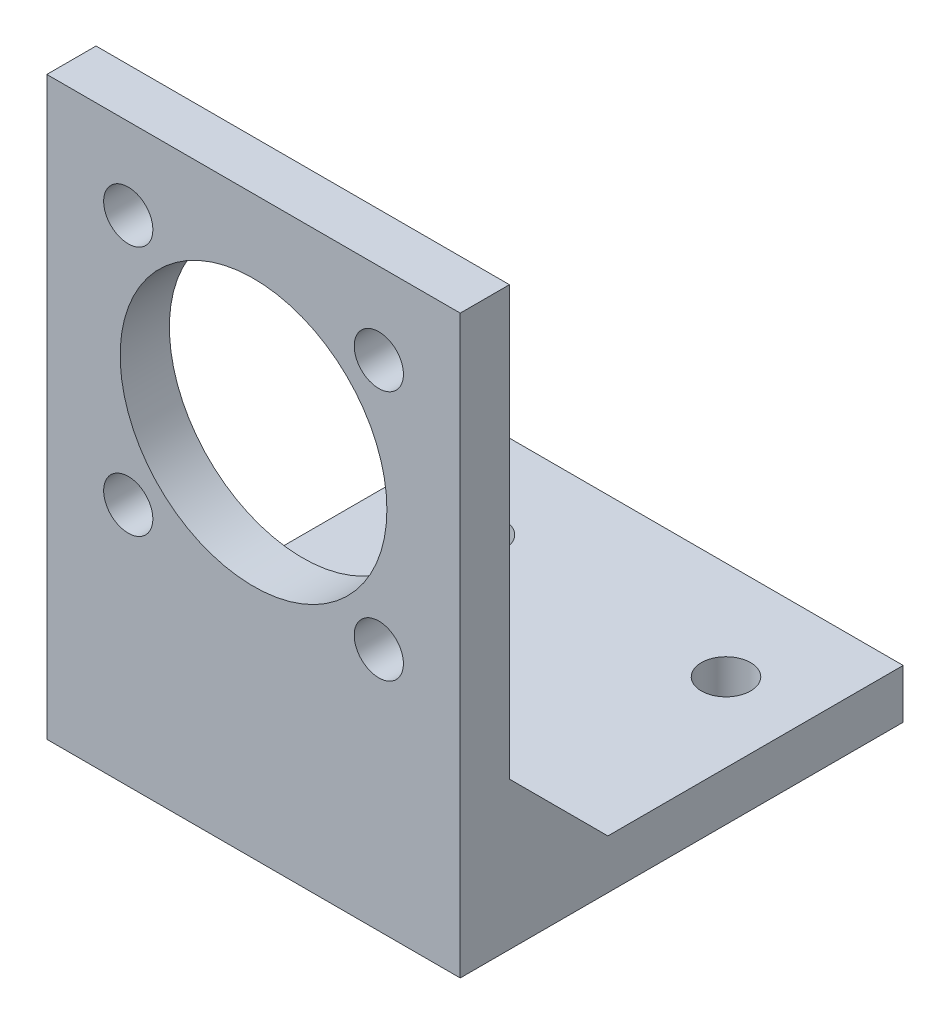
ISO-10303-21;
HEADER;
FILE_DESCRIPTION(('STEP AP214'),'2;1');
FILE_NAME('part.step','',(''),(''),'','','');
FILE_SCHEMA(('AUTOMOTIVE_DESIGN { 1 0 10303 214 1 1 1 1 }'));
ENDSEC;
DATA;
#1=APPLICATION_CONTEXT('core data for automotive mechanical design processes');
#2=APPLICATION_PROTOCOL_DEFINITION('international standard','automotive_design',2000,#1);
#3=PRODUCT_CONTEXT('',#1,'mechanical');
#4=PRODUCT('Part','Part','',(#3));
#5=PRODUCT_RELATED_PRODUCT_CATEGORY('part','',(#4));
#6=PRODUCT_DEFINITION_FORMATION('','',#4);
#7=PRODUCT_DEFINITION_CONTEXT('part definition',#1,'design');
#8=PRODUCT_DEFINITION('design','',#6,#7);
#9=PRODUCT_DEFINITION_SHAPE('','',#8);
#10=(LENGTH_UNIT() NAMED_UNIT(*) SI_UNIT(.MILLI.,.METRE.));
#11=(NAMED_UNIT(*) PLANE_ANGLE_UNIT() SI_UNIT($,.RADIAN.));
#12=(NAMED_UNIT(*) SI_UNIT($,.STERADIAN.) SOLID_ANGLE_UNIT());
#13=UNCERTAINTY_MEASURE_WITH_UNIT(LENGTH_MEASURE(1.E-05),#10,'distance_accuracy_value','');
#14=(GEOMETRIC_REPRESENTATION_CONTEXT(3) GLOBAL_UNCERTAINTY_ASSIGNED_CONTEXT((#13)) GLOBAL_UNIT_ASSIGNED_CONTEXT((#10,
#11,#12)) REPRESENTATION_CONTEXT('',''));
#15=CARTESIAN_POINT('',(0.,0.,0.));
#16=DIRECTION('',(0.,0.,1.));
#17=DIRECTION('',(1.,0.,0.));
#18=AXIS2_PLACEMENT_3D('',#15,#16,#17);
#19=CARTESIAN_POINT('',(0.,5.,0.));
#20=DIRECTION('',(0.,1.,0.));
#21=DIRECTION('',(0.,0.,1.));
#22=AXIS2_PLACEMENT_3D('',#19,#20,#21);
#23=PLANE('',#22);
#24=DIRECTION('',(1.,0.,0.));
#25=VECTOR('',#24,1.);
#26=CARTESIAN_POINT('',(-42.,5.,30.));
#27=LINE('',#26,#25);
#28=CARTESIAN_POINT('',(-42.,5.,30.));
#29=VERTEX_POINT('',#28);
#30=CARTESIAN_POINT('',(-37.,5.,30.));
#31=VERTEX_POINT('',#30);
#32=EDGE_CURVE('E55',#29,#31,#27,.T.);
#33=ORIENTED_EDGE('',*,*,#32,.T.);
#34=DIRECTION('',(0.,0.,-1.));
#35=VECTOR('',#34,1.);
#36=CARTESIAN_POINT('',(-37.,5.,40.));
#37=LINE('',#36,#35);
#38=CARTESIAN_POINT('',(-37.,5.,40.));
#39=VERTEX_POINT('',#38);
#40=EDGE_CURVE('E129',#39,#31,#37,.T.);
#41=ORIENTED_EDGE('',*,*,#40,.F.);
#42=DIRECTION('',(1.,0.,0.));
#43=VECTOR('',#42,1.);
#44=CARTESIAN_POINT('',(0.,5.,40.));
#45=LINE('',#44,#43);
#46=CARTESIAN_POINT('',(-5.,5.,40.));
#47=VERTEX_POINT('',#46);
#48=EDGE_CURVE('E115',#39,#47,#45,.T.);
#49=ORIENTED_EDGE('',*,*,#48,.T.);
#50=DIRECTION('',(0.,0.,-1.));
#51=VECTOR('',#50,1.);
#52=CARTESIAN_POINT('',(-5.,5.,40.));
#53=LINE('',#52,#51);
#54=CARTESIAN_POINT('',(-5.,5.,30.));
#55=VERTEX_POINT('',#54);
#56=EDGE_CURVE('E156',#47,#55,#53,.T.);
#57=ORIENTED_EDGE('',*,*,#56,.T.);
#58=DIRECTION('',(1.,0.,0.));
#59=VECTOR('',#58,1.);
#60=CARTESIAN_POINT('',(-5.,5.,30.));
#61=LINE('',#60,#59);
#62=CARTESIAN_POINT('',(0.,5.,30.));
#63=VERTEX_POINT('',#62);
#64=EDGE_CURVE('E162',#55,#63,#61,.T.);
#65=ORIENTED_EDGE('',*,*,#64,.T.);
#66=DIRECTION('',(0.,0.,-1.));
#67=VECTOR('',#66,1.);
#68=CARTESIAN_POINT('',(0.,5.,0.));
#69=LINE('',#68,#67);
#70=CARTESIAN_POINT('',(0.,5.,0.));
#71=VERTEX_POINT('',#70);
#72=EDGE_CURVE('E126',#63,#71,#69,.T.);
#73=ORIENTED_EDGE('',*,*,#72,.T.);
#74=DIRECTION('',(-1.,0.,0.));
#75=VECTOR('',#74,1.);
#76=CARTESIAN_POINT('',(0.,5.,0.));
#77=LINE('',#76,#75);
#78=CARTESIAN_POINT('',(-42.,5.,0.));
#79=VERTEX_POINT('',#78);
#80=EDGE_CURVE('E258',#71,#79,#77,.T.);
#81=ORIENTED_EDGE('',*,*,#80,.T.);
#82=DIRECTION('',(0.,0.,1.));
#83=VECTOR('',#82,1.);
#84=CARTESIAN_POINT('',(-42.,5.,0.));
#85=LINE('',#84,#83);
#86=EDGE_CURVE('E60',#79,#29,#85,.T.);
#87=ORIENTED_EDGE('',*,*,#86,.T.);
#88=EDGE_LOOP('',(#33,#41,#49,#57,#65,#73,#81,#87));
#89=FACE_BOUND('',#88,.T.);
#90=CARTESIAN_POINT('',(-33.,5.,10.));
#91=DIRECTION('',(0.,1.,0.));
#92=DIRECTION('',(0.,0.,1.));
#93=AXIS2_PLACEMENT_3D('',#90,#91,#92);
#94=CIRCLE('',#93,2.5);
#95=CARTESIAN_POINT('',(-33.,5.,12.5));
#96=VERTEX_POINT('',#95);
#97=EDGE_CURVE('E250',#96,#96,#94,.T.);
#98=ORIENTED_EDGE('',*,*,#97,.F.);
#99=EDGE_LOOP('',(#98));
#100=FACE_BOUND('',#99,.T.);
#101=CARTESIAN_POINT('',(-8.,5.,10.));
#102=DIRECTION('',(0.,1.,0.));
#103=DIRECTION('',(0.,0.,1.));
#104=AXIS2_PLACEMENT_3D('',#101,#102,#103);
#105=CIRCLE('',#104,2.5);
#106=CARTESIAN_POINT('',(-8.,5.,12.5));
#107=VERTEX_POINT('',#106);
#108=EDGE_CURVE('E242',#107,#107,#105,.T.);
#109=ORIENTED_EDGE('',*,*,#108,.F.);
#110=EDGE_LOOP('',(#109));
#111=FACE_BOUND('',#110,.T.);
#112=ADVANCED_FACE('F39',(#89,#100,#111),#23,.T.);
#113=CARTESIAN_POINT('',(0.,0.,0.));
#114=DIRECTION('',(0.,1.,0.));
#115=DIRECTION('',(0.,0.,1.));
#116=AXIS2_PLACEMENT_3D('',#113,#114,#115);
#117=PLANE('',#116);
#118=DIRECTION('',(-1.,0.,0.));
#119=VECTOR('',#118,1.);
#120=CARTESIAN_POINT('',(0.,0.,0.));
#121=LINE('',#120,#119);
#122=CARTESIAN_POINT('',(0.,0.,0.));
#123=VERTEX_POINT('',#122);
#124=CARTESIAN_POINT('',(-42.,0.,0.));
#125=VERTEX_POINT('',#124);
#126=EDGE_CURVE('E254',#123,#125,#121,.T.);
#127=ORIENTED_EDGE('',*,*,#126,.F.);
#128=DIRECTION('',(0.,0.,-1.));
#129=VECTOR('',#128,1.);
#130=CARTESIAN_POINT('',(0.,0.,0.));
#131=LINE('',#130,#129);
#132=CARTESIAN_POINT('',(0.,0.,45.));
#133=VERTEX_POINT('',#132);
#134=EDGE_CURVE('E261',#133,#123,#131,.T.);
#135=ORIENTED_EDGE('',*,*,#134,.F.);
#136=DIRECTION('',(1.,0.,0.));
#137=VECTOR('',#136,1.);
#138=CARTESIAN_POINT('',(-42.,0.,45.));
#139=LINE('',#138,#137);
#140=CARTESIAN_POINT('',(-42.,0.,45.));
#141=VERTEX_POINT('',#140);
#142=EDGE_CURVE('E214',#141,#133,#139,.T.);
#143=ORIENTED_EDGE('',*,*,#142,.F.);
#144=DIRECTION('',(0.,0.,1.));
#145=VECTOR('',#144,1.);
#146=CARTESIAN_POINT('',(-42.,0.,0.));
#147=LINE('',#146,#145);
#148=EDGE_CURVE('E269',#125,#141,#147,.T.);
#149=ORIENTED_EDGE('',*,*,#148,.F.);
#150=EDGE_LOOP('',(#127,#135,#143,#149));
#151=FACE_BOUND('',#150,.T.);
#152=CARTESIAN_POINT('',(-33.,0.,10.));
#153=DIRECTION('',(0.,1.,0.));
#154=DIRECTION('',(0.,0.,1.));
#155=AXIS2_PLACEMENT_3D('',#152,#153,#154);
#156=CIRCLE('',#155,2.5);
#157=CARTESIAN_POINT('',(-33.,0.,12.5));
#158=VERTEX_POINT('',#157);
#159=EDGE_CURVE('E246',#158,#158,#156,.T.);
#160=ORIENTED_EDGE('',*,*,#159,.T.);
#161=EDGE_LOOP('',(#160));
#162=FACE_BOUND('',#161,.T.);
#163=CARTESIAN_POINT('',(-8.,0.,10.));
#164=DIRECTION('',(0.,1.,0.));
#165=DIRECTION('',(0.,0.,1.));
#166=AXIS2_PLACEMENT_3D('',#163,#164,#165);
#167=CIRCLE('',#166,2.5);
#168=CARTESIAN_POINT('',(-8.,0.,12.5));
#169=VERTEX_POINT('',#168);
#170=EDGE_CURVE('E241',#169,#169,#167,.T.);
#171=ORIENTED_EDGE('',*,*,#170,.T.);
#172=EDGE_LOOP('',(#171));
#173=FACE_BOUND('',#172,.T.);
#174=ADVANCED_FACE('F283',(#151,#162,#173),#117,.F.);
#175=CARTESIAN_POINT('',(0.,5.,0.));
#176=DIRECTION('',(0.,0.,1.));
#177=DIRECTION('',(1.,0.,0.));
#178=AXIS2_PLACEMENT_3D('',#175,#176,#177);
#179=PLANE('',#178);
#180=ORIENTED_EDGE('',*,*,#126,.T.);
#181=DIRECTION('',(0.,-1.,0.));
#182=VECTOR('',#181,1.);
#183=CARTESIAN_POINT('',(-42.,5.,0.));
#184=LINE('',#183,#182);
#185=EDGE_CURVE('E11',#79,#125,#184,.T.);
#186=ORIENTED_EDGE('',*,*,#185,.F.);
#187=ORIENTED_EDGE('',*,*,#80,.F.);
#188=DIRECTION('',(0.,-1.,0.));
#189=VECTOR('',#188,1.);
#190=CARTESIAN_POINT('',(0.,5.,0.));
#191=LINE('',#190,#189);
#192=EDGE_CURVE('E48',#71,#123,#191,.T.);
#193=ORIENTED_EDGE('',*,*,#192,.T.);
#194=EDGE_LOOP('',(#180,#186,#187,#193));
#195=FACE_BOUND('',#194,.T.);
#196=ADVANCED_FACE('F41',(#195),#179,.F.);
#197=CARTESIAN_POINT('',(-42.,5.,0.));
#198=DIRECTION('',(1.,0.,0.));
#199=DIRECTION('',(0.,0.,-1.));
#200=AXIS2_PLACEMENT_3D('',#197,#198,#199);
#201=PLANE('',#200);
#202=DIRECTION('',(0.,0.707106781186547,0.707106781186548));
#203=VECTOR('',#202,1.);
#204=CARTESIAN_POINT('',(-42.,5.,30.));
#205=LINE('',#204,#203);
#206=CARTESIAN_POINT('',(-42.,15.,40.));
#207=VERTEX_POINT('',#206);
#208=EDGE_CURVE('E134',#29,#207,#205,.T.);
#209=ORIENTED_EDGE('',*,*,#208,.F.);
#210=ORIENTED_EDGE('',*,*,#86,.F.);
#211=ORIENTED_EDGE('',*,*,#185,.T.);
#212=ORIENTED_EDGE('',*,*,#148,.T.);
#213=DIRECTION('',(0.,-1.,0.));
#214=VECTOR('',#213,1.);
#215=CARTESIAN_POINT('',(-42.,0.,45.));
#216=LINE('',#215,#214);
#217=CARTESIAN_POINT('',(-42.,58.5,45.));
#218=VERTEX_POINT('',#217);
#219=EDGE_CURVE('E210',#218,#141,#216,.T.);
#220=ORIENTED_EDGE('',*,*,#219,.F.);
#221=DIRECTION('',(0.,0.,-1.));
#222=VECTOR('',#221,1.);
#223=CARTESIAN_POINT('',(-42.,58.5,45.));
#224=LINE('',#223,#222);
#225=CARTESIAN_POINT('',(-42.,58.5,40.));
#226=VERTEX_POINT('',#225);
#227=EDGE_CURVE('E225',#218,#226,#224,.T.);
#228=ORIENTED_EDGE('',*,*,#227,.T.);
#229=DIRECTION('',(0.,-1.,0.));
#230=VECTOR('',#229,1.);
#231=CARTESIAN_POINT('',(-42.,0.,40.));
#232=LINE('',#231,#230);
#233=EDGE_CURVE('E206',#226,#207,#232,.T.);
#234=ORIENTED_EDGE('',*,*,#233,.T.);
#235=EDGE_LOOP('',(#209,#210,#211,#212,#220,#228,#234));
#236=FACE_BOUND('',#235,.T.);
#237=ADVANCED_FACE('F289',(#236),#201,.F.);
#238=CARTESIAN_POINT('',(0.,5.,0.));
#239=DIRECTION('',(-1.,0.,0.));
#240=DIRECTION('',(0.,0.,1.));
#241=AXIS2_PLACEMENT_3D('',#238,#239,#240);
#242=PLANE('',#241);
#243=ORIENTED_EDGE('',*,*,#72,.F.);
#244=DIRECTION('',(0.,0.707106781186547,0.707106781186548));
#245=VECTOR('',#244,1.);
#246=CARTESIAN_POINT('',(0.,5.,30.));
#247=LINE('',#246,#245);
#248=CARTESIAN_POINT('',(0.,15.,40.));
#249=VERTEX_POINT('',#248);
#250=EDGE_CURVE('E146',#63,#249,#247,.T.);
#251=ORIENTED_EDGE('',*,*,#250,.T.);
#252=DIRECTION('',(0.,1.,0.));
#253=VECTOR('',#252,1.);
#254=CARTESIAN_POINT('',(0.,0.,40.));
#255=LINE('',#254,#253);
#256=CARTESIAN_POINT('',(0.,58.5,40.));
#257=VERTEX_POINT('',#256);
#258=EDGE_CURVE('E229',#249,#257,#255,.T.);
#259=ORIENTED_EDGE('',*,*,#258,.T.);
#260=DIRECTION('',(0.,0.,-1.));
#261=VECTOR('',#260,1.);
#262=CARTESIAN_POINT('',(0.,58.5,45.));
#263=LINE('',#262,#261);
#264=CARTESIAN_POINT('',(0.,58.5,45.));
#265=VERTEX_POINT('',#264);
#266=EDGE_CURVE('E237',#265,#257,#263,.T.);
#267=ORIENTED_EDGE('',*,*,#266,.F.);
#268=DIRECTION('',(0.,1.,0.));
#269=VECTOR('',#268,1.);
#270=CARTESIAN_POINT('',(0.,0.,45.));
#271=LINE('',#270,#269);
#272=EDGE_CURVE('E219',#133,#265,#271,.T.);
#273=ORIENTED_EDGE('',*,*,#272,.F.);
#274=ORIENTED_EDGE('',*,*,#134,.T.);
#275=ORIENTED_EDGE('',*,*,#192,.F.);
#276=EDGE_LOOP('',(#243,#251,#259,#267,#273,#274,#275));
#277=FACE_BOUND('',#276,.T.);
#278=ADVANCED_FACE('F291',(#277),#242,.F.);
#279=CARTESIAN_POINT('',(-33.,5.,10.));
#280=DIRECTION('',(0.,-1.,0.));
#281=DIRECTION('',(0.,0.,-1.));
#282=AXIS2_PLACEMENT_3D('',#279,#280,#281);
#283=CYLINDRICAL_SURFACE('',#282,2.5);
#284=ORIENTED_EDGE('',*,*,#97,.T.);
#285=EDGE_LOOP('',(#284));
#286=FACE_BOUND('',#285,.T.);
#287=ORIENTED_EDGE('',*,*,#159,.F.);
#288=EDGE_LOOP('',(#287));
#289=FACE_BOUND('',#288,.T.);
#290=ADVANCED_FACE('F354',(#286,#289),#283,.F.);
#291=CARTESIAN_POINT('',(-8.,5.,10.));
#292=DIRECTION('',(0.,-1.,0.));
#293=DIRECTION('',(0.,0.,-1.));
#294=AXIS2_PLACEMENT_3D('',#291,#292,#293);
#295=CYLINDRICAL_SURFACE('',#294,2.5);
#296=ORIENTED_EDGE('',*,*,#108,.T.);
#297=EDGE_LOOP('',(#296));
#298=FACE_BOUND('',#297,.T.);
#299=ORIENTED_EDGE('',*,*,#170,.F.);
#300=EDGE_LOOP('',(#299));
#301=FACE_BOUND('',#300,.T.);
#302=ADVANCED_FACE('F327',(#298,#301),#295,.F.);
#303=CARTESIAN_POINT('',(0.,0.,40.));
#304=DIRECTION('',(0.,0.,-1.));
#305=DIRECTION('',(-1.,0.,0.));
#306=AXIS2_PLACEMENT_3D('',#303,#304,#305);
#307=PLANE('',#306);
#308=DIRECTION('',(1.,0.,0.));
#309=VECTOR('',#308,1.);
#310=CARTESIAN_POINT('',(-42.,15.,40.));
#311=LINE('',#310,#309);
#312=CARTESIAN_POINT('',(-37.,15.,40.));
#313=VERTEX_POINT('',#312);
#314=EDGE_CURVE('E147',#207,#313,#311,.T.);
#315=ORIENTED_EDGE('',*,*,#314,.F.);
#316=ORIENTED_EDGE('',*,*,#233,.F.);
#317=DIRECTION('',(-1.,0.,0.));
#318=VECTOR('',#317,1.);
#319=CARTESIAN_POINT('',(-42.,58.5,40.));
#320=LINE('',#319,#318);
#321=EDGE_CURVE('E215',#257,#226,#320,.T.);
#322=ORIENTED_EDGE('',*,*,#321,.F.);
#323=ORIENTED_EDGE('',*,*,#258,.F.);
#324=DIRECTION('',(1.,0.,0.));
#325=VECTOR('',#324,1.);
#326=CARTESIAN_POINT('',(-5.,15.,40.));
#327=LINE('',#326,#325);
#328=CARTESIAN_POINT('',(-5.,15.,40.));
#329=VERTEX_POINT('',#328);
#330=EDGE_CURVE('E159',#329,#249,#327,.T.);
#331=ORIENTED_EDGE('',*,*,#330,.F.);
#332=DIRECTION('',(0.,-1.,0.));
#333=VECTOR('',#332,1.);
#334=CARTESIAN_POINT('',(-5.,15.,40.));
#335=LINE('',#334,#333);
#336=EDGE_CURVE('E122',#329,#47,#335,.T.);
#337=ORIENTED_EDGE('',*,*,#336,.T.);
#338=ORIENTED_EDGE('',*,*,#48,.F.);
#339=DIRECTION('',(0.,-1.,0.));
#340=VECTOR('',#339,1.);
#341=CARTESIAN_POINT('',(-37.,15.,40.));
#342=LINE('',#341,#340);
#343=EDGE_CURVE('E119',#313,#39,#342,.T.);
#344=ORIENTED_EDGE('',*,*,#343,.F.);
#345=EDGE_LOOP('',(#315,#316,#322,#323,#331,#337,#338,#344));
#346=FACE_BOUND('',#345,.T.);
#347=CARTESIAN_POINT('',(-8.27207793864211,24.7720779386422,40.));
#348=DIRECTION('',(0.,0.,1.));
#349=DIRECTION('',(1.,0.,0.));
#350=AXIS2_PLACEMENT_3D('',#347,#348,#349);
#351=CIRCLE('',#350,2.5);
#352=CARTESIAN_POINT('',(-5.77207793864211,24.7720779386422,40.));
#353=VERTEX_POINT('',#352);
#354=EDGE_CURVE('E166',#353,#353,#351,.T.);
#355=ORIENTED_EDGE('',*,*,#354,.T.);
#356=EDGE_LOOP('',(#355));
#357=FACE_BOUND('',#356,.T.);
#358=CARTESIAN_POINT('',(-8.27207793864211,50.2279220613578,40.));
#359=DIRECTION('',(0.,0.,1.));
#360=DIRECTION('',(1.,0.,0.));
#361=AXIS2_PLACEMENT_3D('',#358,#359,#360);
#362=CIRCLE('',#361,2.5);
#363=CARTESIAN_POINT('',(-5.77207793864211,50.2279220613578,40.));
#364=VERTEX_POINT('',#363);
#365=EDGE_CURVE('E182',#364,#364,#362,.T.);
#366=ORIENTED_EDGE('',*,*,#365,.T.);
#367=EDGE_LOOP('',(#366));
#368=FACE_BOUND('',#367,.T.);
#369=CARTESIAN_POINT('',(-21.,37.5,40.));
#370=DIRECTION('',(0.,0.,1.));
#371=DIRECTION('',(1.,0.,0.));
#372=AXIS2_PLACEMENT_3D('',#369,#370,#371);
#373=CIRCLE('',#372,13.55);
#374=CARTESIAN_POINT('',(-7.44999999999999,37.5,40.));
#375=VERTEX_POINT('',#374);
#376=EDGE_CURVE('E198',#375,#375,#373,.T.);
#377=ORIENTED_EDGE('',*,*,#376,.T.);
#378=EDGE_LOOP('',(#377));
#379=FACE_BOUND('',#378,.T.);
#380=CARTESIAN_POINT('',(-33.7279220613579,24.7720779386422,40.));
#381=DIRECTION('',(0.,0.,1.));
#382=DIRECTION('',(1.,0.,0.));
#383=AXIS2_PLACEMENT_3D('',#380,#381,#382);
#384=CIRCLE('',#383,2.5);
#385=CARTESIAN_POINT('',(-31.2279220613579,24.7720779386422,40.));
#386=VERTEX_POINT('',#385);
#387=EDGE_CURVE('E190',#386,#386,#384,.T.);
#388=ORIENTED_EDGE('',*,*,#387,.T.);
#389=EDGE_LOOP('',(#388));
#390=FACE_BOUND('',#389,.T.);
#391=CARTESIAN_POINT('',(-33.7279220613579,50.2279220613578,40.));
#392=DIRECTION('',(0.,0.,1.));
#393=DIRECTION('',(1.,0.,0.));
#394=AXIS2_PLACEMENT_3D('',#391,#392,#393);
#395=CIRCLE('',#394,2.5);
#396=CARTESIAN_POINT('',(-31.2279220613579,50.2279220613578,40.));
#397=VERTEX_POINT('',#396);
#398=EDGE_CURVE('E174',#397,#397,#395,.T.);
#399=ORIENTED_EDGE('',*,*,#398,.T.);
#400=EDGE_LOOP('',(#399));
#401=FACE_BOUND('',#400,.T.);
#402=ADVANCED_FACE('F116',(#346,#357,#368,#379,#390,#401),#307,.T.);
#403=CARTESIAN_POINT('',(0.,0.,45.));
#404=DIRECTION('',(0.,0.,-1.));
#405=DIRECTION('',(-1.,0.,0.));
#406=AXIS2_PLACEMENT_3D('',#403,#404,#405);
#407=PLANE('',#406);
#408=ORIENTED_EDGE('',*,*,#219,.T.);
#409=ORIENTED_EDGE('',*,*,#142,.T.);
#410=ORIENTED_EDGE('',*,*,#272,.T.);
#411=DIRECTION('',(-1.,0.,0.));
#412=VECTOR('',#411,1.);
#413=CARTESIAN_POINT('',(-42.,58.5,45.));
#414=LINE('',#413,#412);
#415=EDGE_CURVE('E222',#265,#218,#414,.T.);
#416=ORIENTED_EDGE('',*,*,#415,.T.);
#417=EDGE_LOOP('',(#408,#409,#410,#416));
#418=FACE_BOUND('',#417,.T.);
#419=CARTESIAN_POINT('',(-21.,37.5,45.));
#420=DIRECTION('',(0.,0.,1.));
#421=DIRECTION('',(1.,0.,0.));
#422=AXIS2_PLACEMENT_3D('',#419,#420,#421);
#423=CIRCLE('',#422,13.55);
#424=CARTESIAN_POINT('',(-7.44999999999999,37.5,45.));
#425=VERTEX_POINT('',#424);
#426=EDGE_CURVE('E202',#425,#425,#423,.T.);
#427=ORIENTED_EDGE('',*,*,#426,.F.);
#428=EDGE_LOOP('',(#427));
#429=FACE_BOUND('',#428,.T.);
#430=CARTESIAN_POINT('',(-33.7279220613579,24.7720779386422,45.));
#431=DIRECTION('',(0.,0.,1.));
#432=DIRECTION('',(1.,0.,0.));
#433=AXIS2_PLACEMENT_3D('',#430,#431,#432);
#434=CIRCLE('',#433,2.5);
#435=CARTESIAN_POINT('',(-31.2279220613579,24.7720779386422,45.));
#436=VERTEX_POINT('',#435);
#437=EDGE_CURVE('E194',#436,#436,#434,.T.);
#438=ORIENTED_EDGE('',*,*,#437,.F.);
#439=EDGE_LOOP('',(#438));
#440=FACE_BOUND('',#439,.T.);
#441=CARTESIAN_POINT('',(-8.27207793864211,50.2279220613578,45.));
#442=DIRECTION('',(0.,0.,1.));
#443=DIRECTION('',(1.,0.,0.));
#444=AXIS2_PLACEMENT_3D('',#441,#442,#443);
#445=CIRCLE('',#444,2.5);
#446=CARTESIAN_POINT('',(-5.77207793864211,50.2279220613578,45.));
#447=VERTEX_POINT('',#446);
#448=EDGE_CURVE('E186',#447,#447,#445,.T.);
#449=ORIENTED_EDGE('',*,*,#448,.F.);
#450=EDGE_LOOP('',(#449));
#451=FACE_BOUND('',#450,.T.);
#452=CARTESIAN_POINT('',(-33.7279220613579,50.2279220613578,45.));
#453=DIRECTION('',(0.,0.,1.));
#454=DIRECTION('',(1.,0.,0.));
#455=AXIS2_PLACEMENT_3D('',#452,#453,#454);
#456=CIRCLE('',#455,2.5);
#457=CARTESIAN_POINT('',(-31.2279220613579,50.2279220613578,45.));
#458=VERTEX_POINT('',#457);
#459=EDGE_CURVE('E178',#458,#458,#456,.T.);
#460=ORIENTED_EDGE('',*,*,#459,.F.);
#461=EDGE_LOOP('',(#460));
#462=FACE_BOUND('',#461,.T.);
#463=CARTESIAN_POINT('',(-8.27207793864211,24.7720779386422,45.));
#464=DIRECTION('',(0.,0.,1.));
#465=DIRECTION('',(1.,0.,0.));
#466=AXIS2_PLACEMENT_3D('',#463,#464,#465);
#467=CIRCLE('',#466,2.5);
#468=CARTESIAN_POINT('',(-5.77207793864211,24.7720779386422,45.));
#469=VERTEX_POINT('',#468);
#470=EDGE_CURVE('E170',#469,#469,#467,.T.);
#471=ORIENTED_EDGE('',*,*,#470,.F.);
#472=EDGE_LOOP('',(#471));
#473=FACE_BOUND('',#472,.T.);
#474=ADVANCED_FACE('F304',(#418,#429,#440,#451,#462,#473),#407,.F.);
#475=CARTESIAN_POINT('',(-42.,58.5,45.));
#476=DIRECTION('',(0.,-1.,0.));
#477=DIRECTION('',(0.,0.,-1.));
#478=AXIS2_PLACEMENT_3D('',#475,#476,#477);
#479=PLANE('',#478);
#480=ORIENTED_EDGE('',*,*,#321,.T.);
#481=ORIENTED_EDGE('',*,*,#227,.F.);
#482=ORIENTED_EDGE('',*,*,#415,.F.);
#483=ORIENTED_EDGE('',*,*,#266,.T.);
#484=EDGE_LOOP('',(#480,#481,#482,#483));
#485=FACE_BOUND('',#484,.T.);
#486=ADVANCED_FACE('F301',(#485),#479,.F.);
#487=CARTESIAN_POINT('',(-21.,37.5,45.));
#488=DIRECTION('',(0.,0.,-1.));
#489=DIRECTION('',(-1.,0.,0.));
#490=AXIS2_PLACEMENT_3D('',#487,#488,#489);
#491=CYLINDRICAL_SURFACE('',#490,13.55);
#492=ORIENTED_EDGE('',*,*,#426,.T.);
#493=EDGE_LOOP('',(#492));
#494=FACE_BOUND('',#493,.T.);
#495=ORIENTED_EDGE('',*,*,#376,.F.);
#496=EDGE_LOOP('',(#495));
#497=FACE_BOUND('',#496,.T.);
#498=ADVANCED_FACE('F391',(#494,#497),#491,.F.);
#499=CARTESIAN_POINT('',(-33.7279220613579,24.7720779386422,45.));
#500=DIRECTION('',(0.,0.,-1.));
#501=DIRECTION('',(-1.,0.,0.));
#502=AXIS2_PLACEMENT_3D('',#499,#500,#501);
#503=CYLINDRICAL_SURFACE('',#502,2.5);
#504=ORIENTED_EDGE('',*,*,#437,.T.);
#505=EDGE_LOOP('',(#504));
#506=FACE_BOUND('',#505,.T.);
#507=ORIENTED_EDGE('',*,*,#387,.F.);
#508=EDGE_LOOP('',(#507));
#509=FACE_BOUND('',#508,.T.);
#510=ADVANCED_FACE('F344',(#506,#509),#503,.F.);
#511=CARTESIAN_POINT('',(-8.27207793864211,50.2279220613578,45.));
#512=DIRECTION('',(0.,0.,-1.));
#513=DIRECTION('',(-1.,0.,0.));
#514=AXIS2_PLACEMENT_3D('',#511,#512,#513);
#515=CYLINDRICAL_SURFACE('',#514,2.5);
#516=ORIENTED_EDGE('',*,*,#448,.T.);
#517=EDGE_LOOP('',(#516));
#518=FACE_BOUND('',#517,.T.);
#519=ORIENTED_EDGE('',*,*,#365,.F.);
#520=EDGE_LOOP('',(#519));
#521=FACE_BOUND('',#520,.T.);
#522=ADVANCED_FACE('F338',(#518,#521),#515,.F.);
#523=CARTESIAN_POINT('',(-33.7279220613579,50.2279220613578,45.));
#524=DIRECTION('',(0.,0.,-1.));
#525=DIRECTION('',(-1.,0.,0.));
#526=AXIS2_PLACEMENT_3D('',#523,#524,#525);
#527=CYLINDRICAL_SURFACE('',#526,2.5);
#528=ORIENTED_EDGE('',*,*,#459,.T.);
#529=EDGE_LOOP('',(#528));
#530=FACE_BOUND('',#529,.T.);
#531=ORIENTED_EDGE('',*,*,#398,.F.);
#532=EDGE_LOOP('',(#531));
#533=FACE_BOUND('',#532,.T.);
#534=ADVANCED_FACE('F322',(#530,#533),#527,.F.);
#535=CARTESIAN_POINT('',(-8.27207793864211,24.7720779386422,45.));
#536=DIRECTION('',(0.,0.,-1.));
#537=DIRECTION('',(-1.,0.,0.));
#538=AXIS2_PLACEMENT_3D('',#535,#536,#537);
#539=CYLINDRICAL_SURFACE('',#538,2.5);
#540=ORIENTED_EDGE('',*,*,#470,.T.);
#541=EDGE_LOOP('',(#540));
#542=FACE_BOUND('',#541,.T.);
#543=ORIENTED_EDGE('',*,*,#354,.F.);
#544=EDGE_LOOP('',(#543));
#545=FACE_BOUND('',#544,.T.);
#546=ADVANCED_FACE('F319',(#542,#545),#539,.F.);
#547=CARTESIAN_POINT('',(-5.,5.,30.));
#548=DIRECTION('',(0.,0.707106781186548,-0.707106781186547));
#549=DIRECTION('',(0.,0.707106781186547,0.707106781186548));
#550=AXIS2_PLACEMENT_3D('',#547,#548,#549);
#551=PLANE('',#550);
#552=ORIENTED_EDGE('',*,*,#250,.F.);
#553=ORIENTED_EDGE('',*,*,#64,.F.);
#554=DIRECTION('',(0.,0.707106781186547,0.707106781186548));
#555=VECTOR('',#554,1.);
#556=CARTESIAN_POINT('',(-5.,5.,30.));
#557=LINE('',#556,#555);
#558=EDGE_CURVE('E150',#55,#329,#557,.T.);
#559=ORIENTED_EDGE('',*,*,#558,.T.);
#560=ORIENTED_EDGE('',*,*,#330,.T.);
#561=EDGE_LOOP('',(#552,#553,#559,#560));
#562=FACE_BOUND('',#561,.T.);
#563=ADVANCED_FACE('F295',(#562),#551,.T.);
#564=CARTESIAN_POINT('',(-5.,0.,0.));
#565=DIRECTION('',(1.,0.,0.));
#566=DIRECTION('',(0.,0.,-1.));
#567=AXIS2_PLACEMENT_3D('',#564,#565,#566);
#568=PLANE('',#567);
#569=ORIENTED_EDGE('',*,*,#558,.F.);
#570=ORIENTED_EDGE('',*,*,#56,.F.);
#571=ORIENTED_EDGE('',*,*,#336,.F.);
#572=EDGE_LOOP('',(#569,#570,#571));
#573=FACE_BOUND('',#572,.T.);
#574=ADVANCED_FACE('F442',(#573),#568,.F.);
#575=CARTESIAN_POINT('',(-42.,5.,30.));
#576=DIRECTION('',(0.,0.707106781186548,-0.707106781186547));
#577=DIRECTION('',(0.,0.707106781186547,0.707106781186548));
#578=AXIS2_PLACEMENT_3D('',#575,#576,#577);
#579=PLANE('',#578);
#580=DIRECTION('',(0.,0.707106781186547,0.707106781186548));
#581=VECTOR('',#580,1.);
#582=CARTESIAN_POINT('',(-37.,5.,30.));
#583=LINE('',#582,#581);
#584=EDGE_CURVE('E137',#31,#313,#583,.T.);
#585=ORIENTED_EDGE('',*,*,#584,.F.);
#586=ORIENTED_EDGE('',*,*,#32,.F.);
#587=ORIENTED_EDGE('',*,*,#208,.T.);
#588=ORIENTED_EDGE('',*,*,#314,.T.);
#589=EDGE_LOOP('',(#585,#586,#587,#588));
#590=FACE_BOUND('',#589,.T.);
#591=ADVANCED_FACE('F450',(#590),#579,.T.);
#592=CARTESIAN_POINT('',(-37.,0.,0.));
#593=DIRECTION('',(1.,0.,0.));
#594=DIRECTION('',(0.,0.,-1.));
#595=AXIS2_PLACEMENT_3D('',#592,#593,#594);
#596=PLANE('',#595);
#597=ORIENTED_EDGE('',*,*,#584,.T.);
#598=ORIENTED_EDGE('',*,*,#343,.T.);
#599=ORIENTED_EDGE('',*,*,#40,.T.);
#600=EDGE_LOOP('',(#597,#598,#599));
#601=FACE_BOUND('',#600,.T.);
#602=ADVANCED_FACE('F136',(#601),#596,.T.);
#603=CLOSED_SHELL('',(#112,#174,#196,#237,#278,#290,#302,#402,#474,#486,#498,#510,#522,#534,
#546,#563,#574,#591,#602));
#604=MANIFOLD_SOLID_BREP('B2',#603);
#605=ADVANCED_BREP_SHAPE_REPRESENTATION('',(#18,#604),#14);
#606=SHAPE_DEFINITION_REPRESENTATION(#9,#605);
ENDSEC;
END-ISO-10303-21;
